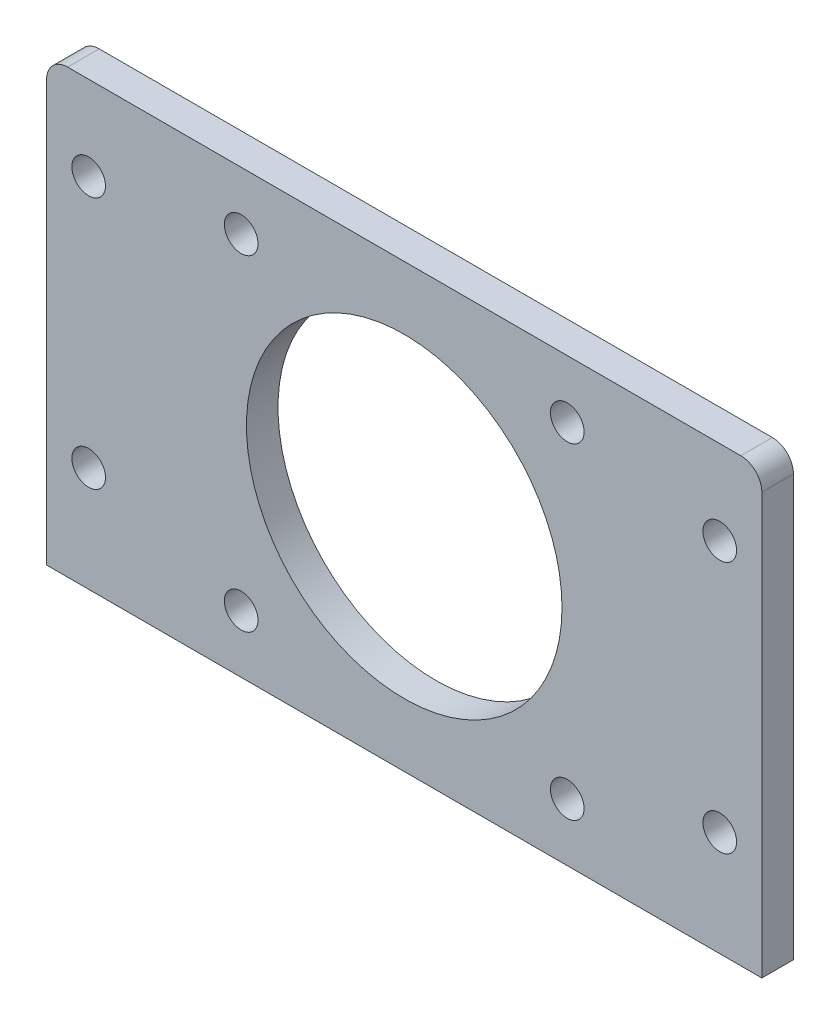
ISO-10303-21;
HEADER;
FILE_DESCRIPTION(('STEP AP214'),'2;1');
FILE_NAME('part.step','',(''),(''),'','','');
FILE_SCHEMA(('AUTOMOTIVE_DESIGN { 1 0 10303 214 1 1 1 1 }'));
ENDSEC;
DATA;
#1=APPLICATION_CONTEXT('core data for automotive mechanical design processes');
#2=APPLICATION_PROTOCOL_DEFINITION('international standard','automotive_design',2000,#1);
#3=PRODUCT_CONTEXT('',#1,'mechanical');
#4=PRODUCT('Part','Part','',(#3));
#5=PRODUCT_RELATED_PRODUCT_CATEGORY('part','',(#4));
#6=PRODUCT_DEFINITION_FORMATION('','',#4);
#7=PRODUCT_DEFINITION_CONTEXT('part definition',#1,'design');
#8=PRODUCT_DEFINITION('design','',#6,#7);
#9=PRODUCT_DEFINITION_SHAPE('','',#8);
#10=(LENGTH_UNIT() NAMED_UNIT(*) SI_UNIT(.MILLI.,.METRE.));
#11=(NAMED_UNIT(*) PLANE_ANGLE_UNIT() SI_UNIT($,.RADIAN.));
#12=(NAMED_UNIT(*) SI_UNIT($,.STERADIAN.) SOLID_ANGLE_UNIT());
#13=UNCERTAINTY_MEASURE_WITH_UNIT(LENGTH_MEASURE(1.E-05),#10,'distance_accuracy_value','');
#14=(GEOMETRIC_REPRESENTATION_CONTEXT(3) GLOBAL_UNCERTAINTY_ASSIGNED_CONTEXT((#13)) GLOBAL_UNIT_ASSIGNED_CONTEXT((#10,
#11,#12)) REPRESENTATION_CONTEXT('',''));
#15=CARTESIAN_POINT('',(0.,0.,0.));
#16=DIRECTION('',(0.,0.,1.));
#17=DIRECTION('',(1.,0.,0.));
#18=AXIS2_PLACEMENT_3D('',#15,#16,#17);
#19=CARTESIAN_POINT('',(-32.,40.,3.));
#20=DIRECTION('',(0.,0.,-1.));
#21=DIRECTION('',(-1.,0.,0.));
#22=AXIS2_PLACEMENT_3D('',#19,#20,#21);
#23=PLANE('',#22);
#24=DIRECTION('',(0.,-1.,0.));
#25=VECTOR('',#24,1.);
#26=CARTESIAN_POINT('',(-34.,0.,3.));
#27=LINE('',#26,#25);
#28=CARTESIAN_POINT('',(-34.,40.,3.));
#29=VERTEX_POINT('',#28);
#30=CARTESIAN_POINT('',(-34.,0.,3.));
#31=VERTEX_POINT('',#30);
#32=EDGE_CURVE('E138',#29,#31,#27,.T.);
#33=ORIENTED_EDGE('',*,*,#32,.T.);
#34=DIRECTION('',(1.,0.,0.));
#35=VECTOR('',#34,1.);
#36=CARTESIAN_POINT('',(-34.,0.,3.));
#37=LINE('',#36,#35);
#38=CARTESIAN_POINT('',(34.,0.,3.));
#39=VERTEX_POINT('',#38);
#40=EDGE_CURVE('E96',#31,#39,#37,.T.);
#41=ORIENTED_EDGE('',*,*,#40,.T.);
#42=DIRECTION('',(0.,1.,0.));
#43=VECTOR('',#42,1.);
#44=CARTESIAN_POINT('',(34.,40.,3.));
#45=LINE('',#44,#43);
#46=CARTESIAN_POINT('',(34.,40.,3.));
#47=VERTEX_POINT('',#46);
#48=EDGE_CURVE('E109',#39,#47,#45,.T.);
#49=ORIENTED_EDGE('',*,*,#48,.T.);
#50=CARTESIAN_POINT('',(32.,40.,3.));
#51=DIRECTION('',(0.,0.,1.));
#52=DIRECTION('',(-1.,0.,0.));
#53=AXIS2_PLACEMENT_3D('',#50,#51,#52);
#54=CIRCLE('',#53,2.);
#55=CARTESIAN_POINT('',(32.,42.,3.));
#56=VERTEX_POINT('',#55);
#57=EDGE_CURVE('E103',#47,#56,#54,.T.);
#58=ORIENTED_EDGE('',*,*,#57,.T.);
#59=DIRECTION('',(-1.,0.,0.));
#60=VECTOR('',#59,1.);
#61=CARTESIAN_POINT('',(-32.,42.,3.));
#62=LINE('',#61,#60);
#63=CARTESIAN_POINT('',(-32.,42.,3.));
#64=VERTEX_POINT('',#63);
#65=EDGE_CURVE('E107',#56,#64,#62,.T.);
#66=ORIENTED_EDGE('',*,*,#65,.T.);
#67=CARTESIAN_POINT('',(-32.,40.,3.));
#68=DIRECTION('',(0.,0.,1.));
#69=DIRECTION('',(-1.,0.,0.));
#70=AXIS2_PLACEMENT_3D('',#67,#68,#69);
#71=CIRCLE('',#70,2.);
#72=EDGE_CURVE('E59',#64,#29,#71,.T.);
#73=ORIENTED_EDGE('',*,*,#72,.T.);
#74=EDGE_LOOP('',(#33,#41,#49,#58,#66,#73));
#75=FACE_BOUND('',#74,.T.);
#76=CARTESIAN_POINT('',(15.5,5.5,3.));
#77=DIRECTION('',(0.,0.,1.));
#78=DIRECTION('',(1.,0.,0.));
#79=AXIS2_PLACEMENT_3D('',#76,#77,#78);
#80=CIRCLE('',#79,1.6);
#81=CARTESIAN_POINT('',(17.1,5.5,3.));
#82=VERTEX_POINT('',#81);
#83=EDGE_CURVE('E131',#82,#82,#80,.T.);
#84=ORIENTED_EDGE('',*,*,#83,.F.);
#85=EDGE_LOOP('',(#84));
#86=FACE_BOUND('',#85,.T.);
#87=CARTESIAN_POINT('',(-15.5,5.5,3.));
#88=DIRECTION('',(0.,0.,1.));
#89=DIRECTION('',(1.,0.,0.));
#90=AXIS2_PLACEMENT_3D('',#87,#88,#89);
#91=CIRCLE('',#90,1.6);
#92=CARTESIAN_POINT('',(-13.9,5.5,3.));
#93=VERTEX_POINT('',#92);
#94=EDGE_CURVE('E252',#93,#93,#91,.T.);
#95=ORIENTED_EDGE('',*,*,#94,.F.);
#96=EDGE_LOOP('',(#95));
#97=FACE_BOUND('',#96,.T.);
#98=CARTESIAN_POINT('',(-15.5,36.5,3.));
#99=DIRECTION('',(0.,0.,1.));
#100=DIRECTION('',(1.,0.,0.));
#101=AXIS2_PLACEMENT_3D('',#98,#99,#100);
#102=CIRCLE('',#101,1.6);
#103=CARTESIAN_POINT('',(-13.9,36.5,3.));
#104=VERTEX_POINT('',#103);
#105=EDGE_CURVE('E246',#104,#104,#102,.T.);
#106=ORIENTED_EDGE('',*,*,#105,.F.);
#107=EDGE_LOOP('',(#106));
#108=FACE_BOUND('',#107,.T.);
#109=CARTESIAN_POINT('',(15.5,36.5,3.));
#110=DIRECTION('',(0.,0.,1.));
#111=DIRECTION('',(1.,0.,0.));
#112=AXIS2_PLACEMENT_3D('',#109,#110,#111);
#113=CIRCLE('',#112,1.6);
#114=CARTESIAN_POINT('',(17.1,36.5,3.));
#115=VERTEX_POINT('',#114);
#116=EDGE_CURVE('E240',#115,#115,#113,.T.);
#117=ORIENTED_EDGE('',*,*,#116,.F.);
#118=EDGE_LOOP('',(#117));
#119=FACE_BOUND('',#118,.T.);
#120=CARTESIAN_POINT('',(30.,10.,3.));
#121=DIRECTION('',(0.,0.,1.));
#122=DIRECTION('',(1.,0.,0.));
#123=AXIS2_PLACEMENT_3D('',#120,#121,#122);
#124=CIRCLE('',#123,1.6);
#125=CARTESIAN_POINT('',(31.6,10.,3.));
#126=VERTEX_POINT('',#125);
#127=EDGE_CURVE('E234',#126,#126,#124,.T.);
#128=ORIENTED_EDGE('',*,*,#127,.F.);
#129=EDGE_LOOP('',(#128));
#130=FACE_BOUND('',#129,.T.);
#131=CARTESIAN_POINT('',(-30.,10.,3.));
#132=DIRECTION('',(0.,0.,1.));
#133=DIRECTION('',(1.,0.,0.));
#134=AXIS2_PLACEMENT_3D('',#131,#132,#133);
#135=CIRCLE('',#134,1.6);
#136=CARTESIAN_POINT('',(-28.4,10.,3.));
#137=VERTEX_POINT('',#136);
#138=EDGE_CURVE('E228',#137,#137,#135,.T.);
#139=ORIENTED_EDGE('',*,*,#138,.F.);
#140=EDGE_LOOP('',(#139));
#141=FACE_BOUND('',#140,.T.);
#142=CARTESIAN_POINT('',(-30.,34.,3.));
#143=DIRECTION('',(0.,0.,1.));
#144=DIRECTION('',(1.,0.,0.));
#145=AXIS2_PLACEMENT_3D('',#142,#143,#144);
#146=CIRCLE('',#145,1.60000000000001);
#147=CARTESIAN_POINT('',(-28.4,34.,3.));
#148=VERTEX_POINT('',#147);
#149=EDGE_CURVE('E222',#148,#148,#146,.T.);
#150=ORIENTED_EDGE('',*,*,#149,.F.);
#151=EDGE_LOOP('',(#150));
#152=FACE_BOUND('',#151,.T.);
#153=CARTESIAN_POINT('',(30.,34.,3.));
#154=DIRECTION('',(0.,0.,1.));
#155=DIRECTION('',(1.,0.,0.));
#156=AXIS2_PLACEMENT_3D('',#153,#154,#155);
#157=CIRCLE('',#156,1.60000000000001);
#158=CARTESIAN_POINT('',(31.6,34.,3.));
#159=VERTEX_POINT('',#158);
#160=EDGE_CURVE('E216',#159,#159,#157,.T.);
#161=ORIENTED_EDGE('',*,*,#160,.F.);
#162=EDGE_LOOP('',(#161));
#163=FACE_BOUND('',#162,.T.);
#164=CARTESIAN_POINT('',(0.,21.,3.));
#165=DIRECTION('',(0.,0.,1.));
#166=DIRECTION('',(1.,0.,0.));
#167=AXIS2_PLACEMENT_3D('',#164,#165,#166);
#168=CIRCLE('',#167,15.);
#169=CARTESIAN_POINT('',(15.,21.,3.));
#170=VERTEX_POINT('',#169);
#171=EDGE_CURVE('E207',#170,#170,#168,.T.);
#172=ORIENTED_EDGE('',*,*,#171,.F.);
#173=EDGE_LOOP('',(#172));
#174=FACE_BOUND('',#173,.T.);
#175=ADVANCED_FACE('F42',(#75,#86,#97,#108,#119,#130,#141,#152,#163,#174),#23,.F.);
#176=CARTESIAN_POINT('',(-32.,40.,0.));
#177=DIRECTION('',(0.,0.,-1.));
#178=DIRECTION('',(-1.,0.,0.));
#179=AXIS2_PLACEMENT_3D('',#176,#177,#178);
#180=PLANE('',#179);
#181=CARTESIAN_POINT('',(30.,34.,0.));
#182=DIRECTION('',(0.,0.,1.));
#183=DIRECTION('',(1.,0.,0.));
#184=AXIS2_PLACEMENT_3D('',#181,#182,#183);
#185=CIRCLE('',#184,1.60000000000001);
#186=CARTESIAN_POINT('',(31.6,34.,0.));
#187=VERTEX_POINT('',#186);
#188=EDGE_CURVE('E213',#187,#187,#185,.T.);
#189=ORIENTED_EDGE('',*,*,#188,.T.);
#190=EDGE_LOOP('',(#189));
#191=FACE_BOUND('',#190,.T.);
#192=CARTESIAN_POINT('',(-30.,10.,0.));
#193=DIRECTION('',(0.,0.,1.));
#194=DIRECTION('',(1.,0.,0.));
#195=AXIS2_PLACEMENT_3D('',#192,#193,#194);
#196=CIRCLE('',#195,1.6);
#197=CARTESIAN_POINT('',(-28.4,10.,0.));
#198=VERTEX_POINT('',#197);
#199=EDGE_CURVE('E225',#198,#198,#196,.T.);
#200=ORIENTED_EDGE('',*,*,#199,.T.);
#201=EDGE_LOOP('',(#200));
#202=FACE_BOUND('',#201,.T.);
#203=CARTESIAN_POINT('',(15.5,36.5,0.));
#204=DIRECTION('',(0.,0.,1.));
#205=DIRECTION('',(1.,0.,0.));
#206=AXIS2_PLACEMENT_3D('',#203,#204,#205);
#207=CIRCLE('',#206,1.6);
#208=CARTESIAN_POINT('',(17.1,36.5,0.));
#209=VERTEX_POINT('',#208);
#210=EDGE_CURVE('E237',#209,#209,#207,.T.);
#211=ORIENTED_EDGE('',*,*,#210,.T.);
#212=EDGE_LOOP('',(#211));
#213=FACE_BOUND('',#212,.T.);
#214=CARTESIAN_POINT('',(-15.5,5.5,0.));
#215=DIRECTION('',(0.,0.,1.));
#216=DIRECTION('',(1.,0.,0.));
#217=AXIS2_PLACEMENT_3D('',#214,#215,#216);
#218=CIRCLE('',#217,1.6);
#219=CARTESIAN_POINT('',(-13.9,5.5,0.));
#220=VERTEX_POINT('',#219);
#221=EDGE_CURVE('E249',#220,#220,#218,.T.);
#222=ORIENTED_EDGE('',*,*,#221,.T.);
#223=EDGE_LOOP('',(#222));
#224=FACE_BOUND('',#223,.T.);
#225=DIRECTION('',(0.,-1.,0.));
#226=VECTOR('',#225,1.);
#227=CARTESIAN_POINT('',(-34.,0.,0.));
#228=LINE('',#227,#226);
#229=CARTESIAN_POINT('',(-34.,40.,0.));
#230=VERTEX_POINT('',#229);
#231=CARTESIAN_POINT('',(-34.,0.,0.));
#232=VERTEX_POINT('',#231);
#233=EDGE_CURVE('E127',#230,#232,#228,.T.);
#234=ORIENTED_EDGE('',*,*,#233,.F.);
#235=CARTESIAN_POINT('',(-32.,40.,0.));
#236=DIRECTION('',(0.,0.,1.));
#237=DIRECTION('',(-1.,0.,0.));
#238=AXIS2_PLACEMENT_3D('',#235,#236,#237);
#239=CIRCLE('',#238,2.);
#240=CARTESIAN_POINT('',(-32.,42.,0.));
#241=VERTEX_POINT('',#240);
#242=EDGE_CURVE('E88',#241,#230,#239,.T.);
#243=ORIENTED_EDGE('',*,*,#242,.F.);
#244=DIRECTION('',(-1.,0.,0.));
#245=VECTOR('',#244,1.);
#246=CARTESIAN_POINT('',(-32.,42.,0.));
#247=LINE('',#246,#245);
#248=CARTESIAN_POINT('',(32.,42.,0.));
#249=VERTEX_POINT('',#248);
#250=EDGE_CURVE('E82',#249,#241,#247,.T.);
#251=ORIENTED_EDGE('',*,*,#250,.F.);
#252=CARTESIAN_POINT('',(32.,40.,0.));
#253=DIRECTION('',(0.,0.,1.));
#254=DIRECTION('',(-1.,0.,0.));
#255=AXIS2_PLACEMENT_3D('',#252,#253,#254);
#256=CIRCLE('',#255,2.);
#257=CARTESIAN_POINT('',(34.,40.,0.));
#258=VERTEX_POINT('',#257);
#259=EDGE_CURVE('E117',#258,#249,#256,.T.);
#260=ORIENTED_EDGE('',*,*,#259,.F.);
#261=DIRECTION('',(0.,1.,0.));
#262=VECTOR('',#261,1.);
#263=CARTESIAN_POINT('',(34.,40.,0.));
#264=LINE('',#263,#262);
#265=CARTESIAN_POINT('',(34.,0.,0.));
#266=VERTEX_POINT('',#265);
#267=EDGE_CURVE('E133',#266,#258,#264,.T.);
#268=ORIENTED_EDGE('',*,*,#267,.F.);
#269=DIRECTION('',(1.,0.,0.));
#270=VECTOR('',#269,1.);
#271=CARTESIAN_POINT('',(-34.,0.,0.));
#272=LINE('',#271,#270);
#273=EDGE_CURVE('E130',#232,#266,#272,.T.);
#274=ORIENTED_EDGE('',*,*,#273,.F.);
#275=EDGE_LOOP('',(#234,#243,#251,#260,#268,#274));
#276=FACE_BOUND('',#275,.T.);
#277=CARTESIAN_POINT('',(15.5,5.5,0.));
#278=DIRECTION('',(0.,0.,1.));
#279=DIRECTION('',(1.,0.,0.));
#280=AXIS2_PLACEMENT_3D('',#277,#278,#279);
#281=CIRCLE('',#280,1.6);
#282=CARTESIAN_POINT('',(17.1,5.5,0.));
#283=VERTEX_POINT('',#282);
#284=EDGE_CURVE('E255',#283,#283,#281,.T.);
#285=ORIENTED_EDGE('',*,*,#284,.T.);
#286=EDGE_LOOP('',(#285));
#287=FACE_BOUND('',#286,.T.);
#288=CARTESIAN_POINT('',(-15.5,36.5,0.));
#289=DIRECTION('',(0.,0.,1.));
#290=DIRECTION('',(1.,0.,0.));
#291=AXIS2_PLACEMENT_3D('',#288,#289,#290);
#292=CIRCLE('',#291,1.6);
#293=CARTESIAN_POINT('',(-13.9,36.5,0.));
#294=VERTEX_POINT('',#293);
#295=EDGE_CURVE('E243',#294,#294,#292,.T.);
#296=ORIENTED_EDGE('',*,*,#295,.T.);
#297=EDGE_LOOP('',(#296));
#298=FACE_BOUND('',#297,.T.);
#299=CARTESIAN_POINT('',(30.,10.,0.));
#300=DIRECTION('',(0.,0.,1.));
#301=DIRECTION('',(1.,0.,0.));
#302=AXIS2_PLACEMENT_3D('',#299,#300,#301);
#303=CIRCLE('',#302,1.6);
#304=CARTESIAN_POINT('',(31.6,10.,0.));
#305=VERTEX_POINT('',#304);
#306=EDGE_CURVE('E231',#305,#305,#303,.T.);
#307=ORIENTED_EDGE('',*,*,#306,.T.);
#308=EDGE_LOOP('',(#307));
#309=FACE_BOUND('',#308,.T.);
#310=CARTESIAN_POINT('',(-30.,34.,0.));
#311=DIRECTION('',(0.,0.,1.));
#312=DIRECTION('',(1.,0.,0.));
#313=AXIS2_PLACEMENT_3D('',#310,#311,#312);
#314=CIRCLE('',#313,1.60000000000001);
#315=CARTESIAN_POINT('',(-28.4,34.,0.));
#316=VERTEX_POINT('',#315);
#317=EDGE_CURVE('E219',#316,#316,#314,.T.);
#318=ORIENTED_EDGE('',*,*,#317,.T.);
#319=EDGE_LOOP('',(#318));
#320=FACE_BOUND('',#319,.T.);
#321=CARTESIAN_POINT('',(0.,21.,0.));
#322=DIRECTION('',(0.,0.,1.));
#323=DIRECTION('',(1.,0.,0.));
#324=AXIS2_PLACEMENT_3D('',#321,#322,#323);
#325=CIRCLE('',#324,15.);
#326=CARTESIAN_POINT('',(15.,21.,0.));
#327=VERTEX_POINT('',#326);
#328=EDGE_CURVE('E210',#327,#327,#325,.T.);
#329=ORIENTED_EDGE('',*,*,#328,.T.);
#330=EDGE_LOOP('',(#329));
#331=FACE_BOUND('',#330,.T.);
#332=ADVANCED_FACE('F147',(#191,#202,#213,#224,#276,#287,#298,#309,#320,#331),#180,.T.);
#333=CARTESIAN_POINT('',(-34.,0.,3.));
#334=DIRECTION('',(1.,0.,0.));
#335=DIRECTION('',(0.,1.,0.));
#336=AXIS2_PLACEMENT_3D('',#333,#334,#335);
#337=PLANE('',#336);
#338=ORIENTED_EDGE('',*,*,#233,.T.);
#339=DIRECTION('',(0.,0.,-1.));
#340=VECTOR('',#339,1.);
#341=CARTESIAN_POINT('',(-34.,0.,3.));
#342=LINE('',#341,#340);
#343=EDGE_CURVE('E11',#31,#232,#342,.T.);
#344=ORIENTED_EDGE('',*,*,#343,.F.);
#345=ORIENTED_EDGE('',*,*,#32,.F.);
#346=DIRECTION('',(0.,0.,-1.));
#347=VECTOR('',#346,1.);
#348=CARTESIAN_POINT('',(-34.,40.,3.));
#349=LINE('',#348,#347);
#350=EDGE_CURVE('E123',#29,#230,#349,.T.);
#351=ORIENTED_EDGE('',*,*,#350,.T.);
#352=EDGE_LOOP('',(#338,#344,#345,#351));
#353=FACE_BOUND('',#352,.T.);
#354=ADVANCED_FACE('F44',(#353),#337,.F.);
#355=CARTESIAN_POINT('',(-34.,0.,3.));
#356=DIRECTION('',(0.,1.,0.));
#357=DIRECTION('',(0.,0.,1.));
#358=AXIS2_PLACEMENT_3D('',#355,#356,#357);
#359=PLANE('',#358);
#360=ORIENTED_EDGE('',*,*,#273,.T.);
#361=DIRECTION('',(0.,0.,-1.));
#362=VECTOR('',#361,1.);
#363=CARTESIAN_POINT('',(34.,0.,3.));
#364=LINE('',#363,#362);
#365=EDGE_CURVE('E51',#39,#266,#364,.T.);
#366=ORIENTED_EDGE('',*,*,#365,.F.);
#367=ORIENTED_EDGE('',*,*,#40,.F.);
#368=ORIENTED_EDGE('',*,*,#343,.T.);
#369=EDGE_LOOP('',(#360,#366,#367,#368));
#370=FACE_BOUND('',#369,.T.);
#371=ADVANCED_FACE('F364',(#370),#359,.F.);
#372=CARTESIAN_POINT('',(34.,40.,3.));
#373=DIRECTION('',(-1.,0.,0.));
#374=DIRECTION('',(0.,-1.,0.));
#375=AXIS2_PLACEMENT_3D('',#372,#373,#374);
#376=PLANE('',#375);
#377=ORIENTED_EDGE('',*,*,#267,.T.);
#378=DIRECTION('',(0.,0.,-1.));
#379=VECTOR('',#378,1.);
#380=CARTESIAN_POINT('',(34.,40.,3.));
#381=LINE('',#380,#379);
#382=EDGE_CURVE('E118',#47,#258,#381,.T.);
#383=ORIENTED_EDGE('',*,*,#382,.F.);
#384=ORIENTED_EDGE('',*,*,#48,.F.);
#385=ORIENTED_EDGE('',*,*,#365,.T.);
#386=EDGE_LOOP('',(#377,#383,#384,#385));
#387=FACE_BOUND('',#386,.T.);
#388=ADVANCED_FACE('F144',(#387),#376,.F.);
#389=CARTESIAN_POINT('',(32.,40.,3.));
#390=DIRECTION('',(0.,0.,-1.));
#391=DIRECTION('',(-1.,0.,0.));
#392=AXIS2_PLACEMENT_3D('',#389,#390,#391);
#393=CYLINDRICAL_SURFACE('',#392,2.);
#394=ORIENTED_EDGE('',*,*,#259,.T.);
#395=DIRECTION('',(0.,0.,-1.));
#396=VECTOR('',#395,1.);
#397=CARTESIAN_POINT('',(32.,42.,3.));
#398=LINE('',#397,#396);
#399=EDGE_CURVE('E114',#56,#249,#398,.T.);
#400=ORIENTED_EDGE('',*,*,#399,.F.);
#401=ORIENTED_EDGE('',*,*,#57,.F.);
#402=ORIENTED_EDGE('',*,*,#382,.T.);
#403=EDGE_LOOP('',(#394,#400,#401,#402));
#404=FACE_BOUND('',#403,.T.);
#405=ADVANCED_FACE('F115',(#404),#393,.T.);
#406=CARTESIAN_POINT('',(-32.,42.,3.));
#407=DIRECTION('',(0.,-1.,0.));
#408=DIRECTION('',(0.,0.,-1.));
#409=AXIS2_PLACEMENT_3D('',#406,#407,#408);
#410=PLANE('',#409);
#411=ORIENTED_EDGE('',*,*,#250,.T.);
#412=DIRECTION('',(0.,0.,-1.));
#413=VECTOR('',#412,1.);
#414=CARTESIAN_POINT('',(-32.,42.,3.));
#415=LINE('',#414,#413);
#416=EDGE_CURVE('E119',#64,#241,#415,.T.);
#417=ORIENTED_EDGE('',*,*,#416,.F.);
#418=ORIENTED_EDGE('',*,*,#65,.F.);
#419=ORIENTED_EDGE('',*,*,#399,.T.);
#420=EDGE_LOOP('',(#411,#417,#418,#419));
#421=FACE_BOUND('',#420,.T.);
#422=ADVANCED_FACE('F121',(#421),#410,.F.);
#423=CARTESIAN_POINT('',(-32.,40.,3.));
#424=DIRECTION('',(0.,0.,-1.));
#425=DIRECTION('',(-1.,0.,0.));
#426=AXIS2_PLACEMENT_3D('',#423,#424,#425);
#427=CYLINDRICAL_SURFACE('',#426,2.);
#428=ORIENTED_EDGE('',*,*,#242,.T.);
#429=ORIENTED_EDGE('',*,*,#350,.F.);
#430=ORIENTED_EDGE('',*,*,#72,.F.);
#431=ORIENTED_EDGE('',*,*,#416,.T.);
#432=EDGE_LOOP('',(#428,#429,#430,#431));
#433=FACE_BOUND('',#432,.T.);
#434=ADVANCED_FACE('F152',(#433),#427,.T.);
#435=CARTESIAN_POINT('',(15.5,5.5,3.));
#436=DIRECTION('',(0.,0.,-1.));
#437=DIRECTION('',(-1.,0.,0.));
#438=AXIS2_PLACEMENT_3D('',#435,#436,#437);
#439=CYLINDRICAL_SURFACE('',#438,1.6);
#440=ORIENTED_EDGE('',*,*,#83,.T.);
#441=EDGE_LOOP('',(#440));
#442=FACE_BOUND('',#441,.T.);
#443=ORIENTED_EDGE('',*,*,#284,.F.);
#444=EDGE_LOOP('',(#443));
#445=FACE_BOUND('',#444,.T.);
#446=ADVANCED_FACE('F154',(#442,#445),#439,.F.);
#447=CARTESIAN_POINT('',(-15.5,5.5,3.));
#448=DIRECTION('',(0.,0.,-1.));
#449=DIRECTION('',(-1.,0.,0.));
#450=AXIS2_PLACEMENT_3D('',#447,#448,#449);
#451=CYLINDRICAL_SURFACE('',#450,1.6);
#452=ORIENTED_EDGE('',*,*,#94,.T.);
#453=EDGE_LOOP('',(#452));
#454=FACE_BOUND('',#453,.T.);
#455=ORIENTED_EDGE('',*,*,#221,.F.);
#456=EDGE_LOOP('',(#455));
#457=FACE_BOUND('',#456,.T.);
#458=ADVANCED_FACE('F160',(#454,#457),#451,.F.);
#459=CARTESIAN_POINT('',(-15.5,36.5,3.));
#460=DIRECTION('',(0.,0.,-1.));
#461=DIRECTION('',(-1.,0.,0.));
#462=AXIS2_PLACEMENT_3D('',#459,#460,#461);
#463=CYLINDRICAL_SURFACE('',#462,1.6);
#464=ORIENTED_EDGE('',*,*,#105,.T.);
#465=EDGE_LOOP('',(#464));
#466=FACE_BOUND('',#465,.T.);
#467=ORIENTED_EDGE('',*,*,#295,.F.);
#468=EDGE_LOOP('',(#467));
#469=FACE_BOUND('',#468,.T.);
#470=ADVANCED_FACE('F174',(#466,#469),#463,.F.);
#471=CARTESIAN_POINT('',(15.5,36.5,3.));
#472=DIRECTION('',(0.,0.,-1.));
#473=DIRECTION('',(-1.,0.,0.));
#474=AXIS2_PLACEMENT_3D('',#471,#472,#473);
#475=CYLINDRICAL_SURFACE('',#474,1.6);
#476=ORIENTED_EDGE('',*,*,#116,.T.);
#477=EDGE_LOOP('',(#476));
#478=FACE_BOUND('',#477,.T.);
#479=ORIENTED_EDGE('',*,*,#210,.F.);
#480=EDGE_LOOP('',(#479));
#481=FACE_BOUND('',#480,.T.);
#482=ADVANCED_FACE('F178',(#478,#481),#475,.F.);
#483=CARTESIAN_POINT('',(30.,10.,3.));
#484=DIRECTION('',(0.,0.,-1.));
#485=DIRECTION('',(-1.,0.,0.));
#486=AXIS2_PLACEMENT_3D('',#483,#484,#485);
#487=CYLINDRICAL_SURFACE('',#486,1.6);
#488=ORIENTED_EDGE('',*,*,#127,.T.);
#489=EDGE_LOOP('',(#488));
#490=FACE_BOUND('',#489,.T.);
#491=ORIENTED_EDGE('',*,*,#306,.F.);
#492=EDGE_LOOP('',(#491));
#493=FACE_BOUND('',#492,.T.);
#494=ADVANCED_FACE('F182',(#490,#493),#487,.F.);
#495=CARTESIAN_POINT('',(-30.,10.,3.));
#496=DIRECTION('',(0.,0.,-1.));
#497=DIRECTION('',(-1.,0.,0.));
#498=AXIS2_PLACEMENT_3D('',#495,#496,#497);
#499=CYLINDRICAL_SURFACE('',#498,1.6);
#500=ORIENTED_EDGE('',*,*,#138,.T.);
#501=EDGE_LOOP('',(#500));
#502=FACE_BOUND('',#501,.T.);
#503=ORIENTED_EDGE('',*,*,#199,.F.);
#504=EDGE_LOOP('',(#503));
#505=FACE_BOUND('',#504,.T.);
#506=ADVANCED_FACE('F186',(#502,#505),#499,.F.);
#507=CARTESIAN_POINT('',(-30.,34.,3.));
#508=DIRECTION('',(0.,0.,-1.));
#509=DIRECTION('',(-1.,0.,0.));
#510=AXIS2_PLACEMENT_3D('',#507,#508,#509);
#511=CYLINDRICAL_SURFACE('',#510,1.60000000000001);
#512=ORIENTED_EDGE('',*,*,#149,.T.);
#513=EDGE_LOOP('',(#512));
#514=FACE_BOUND('',#513,.T.);
#515=ORIENTED_EDGE('',*,*,#317,.F.);
#516=EDGE_LOOP('',(#515));
#517=FACE_BOUND('',#516,.T.);
#518=ADVANCED_FACE('F190',(#514,#517),#511,.F.);
#519=CARTESIAN_POINT('',(30.,34.,3.));
#520=DIRECTION('',(0.,0.,-1.));
#521=DIRECTION('',(-1.,0.,0.));
#522=AXIS2_PLACEMENT_3D('',#519,#520,#521);
#523=CYLINDRICAL_SURFACE('',#522,1.60000000000001);
#524=ORIENTED_EDGE('',*,*,#160,.T.);
#525=EDGE_LOOP('',(#524));
#526=FACE_BOUND('',#525,.T.);
#527=ORIENTED_EDGE('',*,*,#188,.F.);
#528=EDGE_LOOP('',(#527));
#529=FACE_BOUND('',#528,.T.);
#530=ADVANCED_FACE('F194',(#526,#529),#523,.F.);
#531=CARTESIAN_POINT('',(0.,21.,3.));
#532=DIRECTION('',(0.,0.,-1.));
#533=DIRECTION('',(-1.,0.,0.));
#534=AXIS2_PLACEMENT_3D('',#531,#532,#533);
#535=CYLINDRICAL_SURFACE('',#534,15.);
#536=ORIENTED_EDGE('',*,*,#171,.T.);
#537=EDGE_LOOP('',(#536));
#538=FACE_BOUND('',#537,.T.);
#539=ORIENTED_EDGE('',*,*,#328,.F.);
#540=EDGE_LOOP('',(#539));
#541=FACE_BOUND('',#540,.T.);
#542=ADVANCED_FACE('F198',(#538,#541),#535,.F.);
#543=CLOSED_SHELL('',(#175,#332,#354,#371,#388,#405,#422,#434,#446,#458,#470,#482,#494,#506,
#518,#530,#542));
#544=MANIFOLD_SOLID_BREP('B2',#543);
#545=ADVANCED_BREP_SHAPE_REPRESENTATION('',(#18,#544),#14);
#546=SHAPE_DEFINITION_REPRESENTATION(#9,#545);
ENDSEC;
END-ISO-10303-21;
